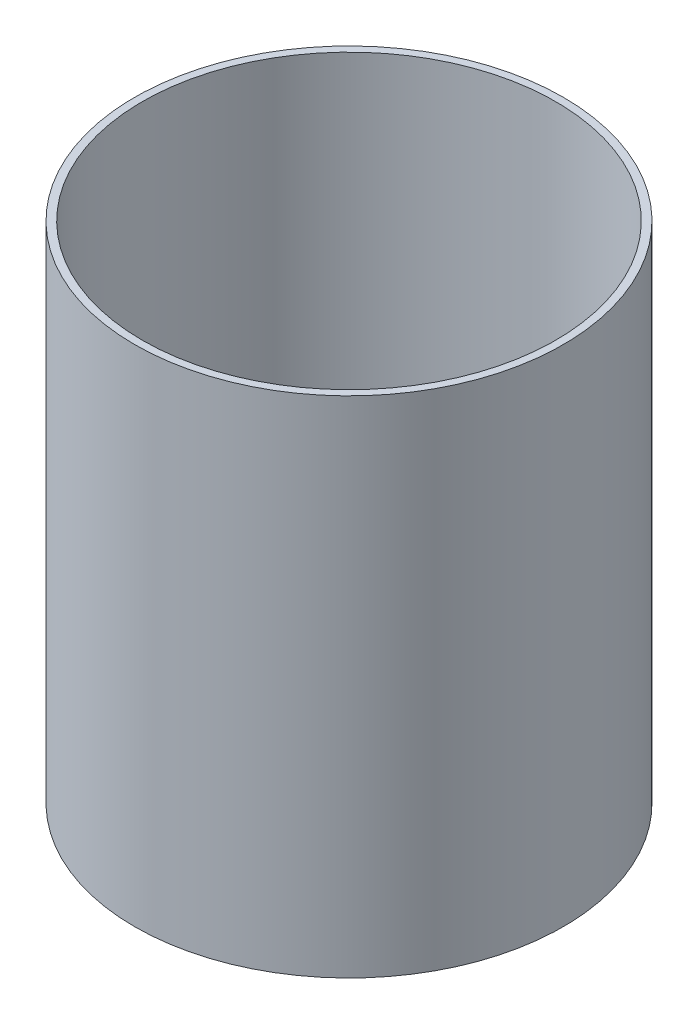
ISO-10303-21;
HEADER;
FILE_DESCRIPTION(('STEP AP214'),'2;1');
FILE_NAME('part.step','',(''),(''),'','','');
FILE_SCHEMA(('AUTOMOTIVE_DESIGN { 1 0 10303 214 1 1 1 1 }'));
ENDSEC;
DATA;
#1=APPLICATION_CONTEXT('core data for automotive mechanical design processes');
#2=APPLICATION_PROTOCOL_DEFINITION('international standard','automotive_design',2000,#1);
#3=PRODUCT_CONTEXT('',#1,'mechanical');
#4=PRODUCT('Part','Part','',(#3));
#5=PRODUCT_RELATED_PRODUCT_CATEGORY('part','',(#4));
#6=PRODUCT_DEFINITION_FORMATION('','',#4);
#7=PRODUCT_DEFINITION_CONTEXT('part definition',#1,'design');
#8=PRODUCT_DEFINITION('design','',#6,#7);
#9=PRODUCT_DEFINITION_SHAPE('','',#8);
#10=(LENGTH_UNIT() NAMED_UNIT(*) SI_UNIT(.MILLI.,.METRE.));
#11=(NAMED_UNIT(*) PLANE_ANGLE_UNIT() SI_UNIT($,.RADIAN.));
#12=(NAMED_UNIT(*) SI_UNIT($,.STERADIAN.) SOLID_ANGLE_UNIT());
#13=UNCERTAINTY_MEASURE_WITH_UNIT(LENGTH_MEASURE(1.E-05),#10,'distance_accuracy_value','');
#14=(GEOMETRIC_REPRESENTATION_CONTEXT(3) GLOBAL_UNCERTAINTY_ASSIGNED_CONTEXT((#13)) GLOBAL_UNIT_ASSIGNED_CONTEXT((#10,
#11,#12)) REPRESENTATION_CONTEXT('',''));
#15=CARTESIAN_POINT('',(0.,0.,0.));
#16=DIRECTION('',(0.,0.,1.));
#17=DIRECTION('',(1.,0.,0.));
#18=AXIS2_PLACEMENT_3D('',#15,#16,#17);
#19=CARTESIAN_POINT('',(0.,200.,0.));
#20=DIRECTION('',(0.,1.,0.));
#21=DIRECTION('',(0.,0.,1.));
#22=AXIS2_PLACEMENT_3D('',#19,#20,#21);
#23=PLANE('',#22);
#24=CARTESIAN_POINT('',(0.,200.,0.));
#25=DIRECTION('',(0.,1.,0.));
#26=DIRECTION('',(0.,0.,1.));
#27=AXIS2_PLACEMENT_3D('',#24,#25,#26);
#28=CIRCLE('',#27,85.);
#29=CARTESIAN_POINT('',(0.,200.,85.));
#30=VERTEX_POINT('',#29);
#31=EDGE_CURVE('E10',#30,#30,#28,.T.);
#32=ORIENTED_EDGE('',*,*,#31,.T.);
#33=EDGE_LOOP('',(#32));
#34=FACE_BOUND('',#33,.T.);
#35=CARTESIAN_POINT('',(0.,200.,0.));
#36=DIRECTION('',(0.,1.,0.));
#37=DIRECTION('',(0.,0.,1.));
#38=AXIS2_PLACEMENT_3D('',#35,#36,#37);
#39=CIRCLE('',#38,82.);
#40=CARTESIAN_POINT('',(0.,200.,82.));
#41=VERTEX_POINT('',#40);
#42=EDGE_CURVE('E56',#41,#41,#39,.T.);
#43=ORIENTED_EDGE('',*,*,#42,.F.);
#44=EDGE_LOOP('',(#43));
#45=FACE_BOUND('',#44,.T.);
#46=ADVANCED_FACE('F43',(#34,#45),#23,.T.);
#47=CARTESIAN_POINT('',(0.,0.,0.));
#48=DIRECTION('',(0.,1.,0.));
#49=DIRECTION('',(0.,0.,1.));
#50=AXIS2_PLACEMENT_3D('',#47,#48,#49);
#51=PLANE('',#50);
#52=CARTESIAN_POINT('',(0.,0.,0.));
#53=DIRECTION('',(0.,1.,0.));
#54=DIRECTION('',(0.,0.,1.));
#55=AXIS2_PLACEMENT_3D('',#52,#53,#54);
#56=CIRCLE('',#55,85.);
#57=CARTESIAN_POINT('',(0.,0.,85.));
#58=VERTEX_POINT('',#57);
#59=EDGE_CURVE('E47',#58,#58,#56,.T.);
#60=ORIENTED_EDGE('',*,*,#59,.F.);
#61=EDGE_LOOP('',(#60));
#62=FACE_BOUND('',#61,.T.);
#63=CARTESIAN_POINT('',(0.,0.,0.));
#64=DIRECTION('',(0.,1.,0.));
#65=DIRECTION('',(0.,0.,1.));
#66=AXIS2_PLACEMENT_3D('',#63,#64,#65);
#67=CIRCLE('',#66,82.);
#68=CARTESIAN_POINT('',(0.,0.,82.));
#69=VERTEX_POINT('',#68);
#70=EDGE_CURVE('E58',#69,#69,#67,.T.);
#71=ORIENTED_EDGE('',*,*,#70,.T.);
#72=EDGE_LOOP('',(#71));
#73=FACE_BOUND('',#72,.T.);
#74=ADVANCED_FACE('F70',(#62,#73),#51,.F.);
#75=CARTESIAN_POINT('',(0.,200.,0.));
#76=DIRECTION('',(0.,-1.,0.));
#77=DIRECTION('',(0.,0.,-1.));
#78=AXIS2_PLACEMENT_3D('',#75,#76,#77);
#79=CYLINDRICAL_SURFACE('',#78,85.);
#80=ORIENTED_EDGE('',*,*,#31,.F.);
#81=EDGE_LOOP('',(#80));
#82=FACE_BOUND('',#81,.T.);
#83=ORIENTED_EDGE('',*,*,#59,.T.);
#84=EDGE_LOOP('',(#83));
#85=FACE_BOUND('',#84,.T.);
#86=ADVANCED_FACE('F45',(#82,#85),#79,.T.);
#87=CARTESIAN_POINT('',(0.,200.,0.));
#88=DIRECTION('',(0.,-1.,0.));
#89=DIRECTION('',(0.,0.,-1.));
#90=AXIS2_PLACEMENT_3D('',#87,#88,#89);
#91=CYLINDRICAL_SURFACE('',#90,82.);
#92=ORIENTED_EDGE('',*,*,#42,.T.);
#93=EDGE_LOOP('',(#92));
#94=FACE_BOUND('',#93,.T.);
#95=ORIENTED_EDGE('',*,*,#70,.F.);
#96=EDGE_LOOP('',(#95));
#97=FACE_BOUND('',#96,.T.);
#98=ADVANCED_FACE('F66',(#94,#97),#91,.F.);
#99=CLOSED_SHELL('',(#46,#74,#86,#98));
#100=MANIFOLD_SOLID_BREP('B2',#99);
#101=ADVANCED_BREP_SHAPE_REPRESENTATION('',(#18,#100),#14);
#102=SHAPE_DEFINITION_REPRESENTATION(#9,#101);
ENDSEC;
END-ISO-10303-21;
